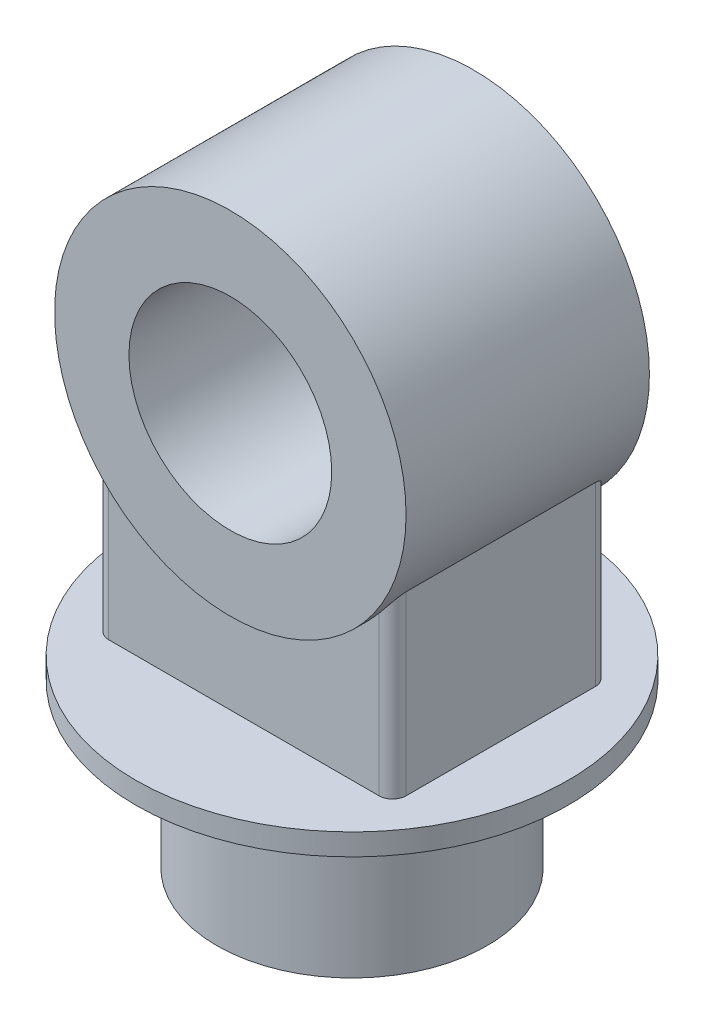
ISO-10303-21;
HEADER;
FILE_DESCRIPTION(('STEP AP214'),'2;1');
FILE_NAME('part.step','',(''),(''),'','','');
FILE_SCHEMA(('AUTOMOTIVE_DESIGN { 1 0 10303 214 1 1 1 1 }'));
ENDSEC;
DATA;
#1=APPLICATION_CONTEXT('core data for automotive mechanical design processes');
#2=APPLICATION_PROTOCOL_DEFINITION('international standard','automotive_design',2000,#1);
#3=PRODUCT_CONTEXT('',#1,'mechanical');
#4=PRODUCT('Part','Part','',(#3));
#5=PRODUCT_RELATED_PRODUCT_CATEGORY('part','',(#4));
#6=PRODUCT_DEFINITION_FORMATION('','',#4);
#7=PRODUCT_DEFINITION_CONTEXT('part definition',#1,'design');
#8=PRODUCT_DEFINITION('design','',#6,#7);
#9=PRODUCT_DEFINITION_SHAPE('','',#8);
#10=(LENGTH_UNIT() NAMED_UNIT(*) SI_UNIT(.MILLI.,.METRE.));
#11=(NAMED_UNIT(*) PLANE_ANGLE_UNIT() SI_UNIT($,.RADIAN.));
#12=(NAMED_UNIT(*) SI_UNIT($,.STERADIAN.) SOLID_ANGLE_UNIT());
#13=UNCERTAINTY_MEASURE_WITH_UNIT(LENGTH_MEASURE(1.E-05),#10,'distance_accuracy_value','');
#14=(GEOMETRIC_REPRESENTATION_CONTEXT(3) GLOBAL_UNCERTAINTY_ASSIGNED_CONTEXT((#13)) GLOBAL_UNIT_ASSIGNED_CONTEXT((#10,
#11,#12)) REPRESENTATION_CONTEXT('',''));
#15=CARTESIAN_POINT('',(0.,0.,0.));
#16=DIRECTION('',(0.,0.,1.));
#17=DIRECTION('',(1.,0.,0.));
#18=AXIS2_PLACEMENT_3D('',#15,#16,#17);
#19=CARTESIAN_POINT('',(0.,120.,0.));
#20=DIRECTION('',(0.,-1.,0.));
#21=DIRECTION('',(0.,0.,-1.));
#22=AXIS2_PLACEMENT_3D('',#19,#20,#21);
#23=CYLINDRICAL_SURFACE('',#22,100.);
#24=CARTESIAN_POINT('',(0.,120.,0.));
#25=DIRECTION('',(0.,1.,0.));
#26=DIRECTION('',(0.,0.,1.));
#27=AXIS2_PLACEMENT_3D('',#24,#25,#26);
#28=CIRCLE('',#27,100.);
#29=CARTESIAN_POINT('',(0.,120.,100.));
#30=VERTEX_POINT('',#29);
#31=EDGE_CURVE('E142',#30,#30,#28,.T.);
#32=ORIENTED_EDGE('',*,*,#31,.F.);
#33=EDGE_LOOP('',(#32));
#34=FACE_BOUND('',#33,.T.);
#35=CARTESIAN_POINT('',(0.,0.,0.));
#36=DIRECTION('',(0.,1.,0.));
#37=DIRECTION('',(0.,0.,1.));
#38=AXIS2_PLACEMENT_3D('',#35,#36,#37);
#39=CIRCLE('',#38,100.);
#40=CARTESIAN_POINT('',(0.,0.,100.));
#41=VERTEX_POINT('',#40);
#42=EDGE_CURVE('E215',#41,#41,#39,.T.);
#43=ORIENTED_EDGE('',*,*,#42,.T.);
#44=EDGE_LOOP('',(#43));
#45=FACE_BOUND('',#44,.T.);
#46=ADVANCED_FACE('F41',(#34,#45),#23,.T.);
#47=CARTESIAN_POINT('',(0.,0.,0.));
#48=DIRECTION('',(0.,1.,0.));
#49=DIRECTION('',(0.,0.,1.));
#50=AXIS2_PLACEMENT_3D('',#47,#48,#49);
#51=PLANE('',#50);
#52=ORIENTED_EDGE('',*,*,#42,.F.);
#53=EDGE_LOOP('',(#52));
#54=FACE_BOUND('',#53,.T.);
#55=ADVANCED_FACE('F203',(#54),#51,.F.);
#56=CARTESIAN_POINT('',(0.,136.,0.));
#57=DIRECTION('',(0.,-1.,0.));
#58=DIRECTION('',(0.,0.,-1.));
#59=AXIS2_PLACEMENT_3D('',#56,#57,#58);
#60=CYLINDRICAL_SURFACE('',#59,160.);
#61=CARTESIAN_POINT('',(0.,136.,0.));
#62=DIRECTION('',(0.,1.,0.));
#63=DIRECTION('',(0.,0.,1.));
#64=AXIS2_PLACEMENT_3D('',#61,#62,#63);
#65=CIRCLE('',#64,160.);
#66=CARTESIAN_POINT('',(0.,136.,160.));
#67=VERTEX_POINT('',#66);
#68=EDGE_CURVE('E216',#67,#67,#65,.T.);
#69=ORIENTED_EDGE('',*,*,#68,.F.);
#70=EDGE_LOOP('',(#69));
#71=FACE_BOUND('',#70,.T.);
#72=CARTESIAN_POINT('',(0.,120.,0.));
#73=DIRECTION('',(0.,1.,0.));
#74=DIRECTION('',(0.,0.,1.));
#75=AXIS2_PLACEMENT_3D('',#72,#73,#74);
#76=CIRCLE('',#75,160.);
#77=CARTESIAN_POINT('',(0.,120.,160.));
#78=VERTEX_POINT('',#77);
#79=EDGE_CURVE('E219',#78,#78,#76,.T.);
#80=ORIENTED_EDGE('',*,*,#79,.T.);
#81=EDGE_LOOP('',(#80));
#82=FACE_BOUND('',#81,.T.);
#83=ADVANCED_FACE('F208',(#71,#82),#60,.T.);
#84=CARTESIAN_POINT('',(0.,136.,0.));
#85=DIRECTION('',(0.,1.,0.));
#86=DIRECTION('',(0.,0.,1.));
#87=AXIS2_PLACEMENT_3D('',#84,#85,#86);
#88=PLANE('',#87);
#89=DIRECTION('',(0.,0.,-1.));
#90=VECTOR('',#89,1.);
#91=CARTESIAN_POINT('',(110.,136.,-80.));
#92=LINE('',#91,#90);
#93=CARTESIAN_POINT('',(110.,136.,70.));
#94=VERTEX_POINT('',#93);
#95=CARTESIAN_POINT('',(110.,136.,-70.));
#96=VERTEX_POINT('',#95);
#97=EDGE_CURVE('E223',#94,#96,#92,.T.);
#98=ORIENTED_EDGE('',*,*,#97,.F.);
#99=CARTESIAN_POINT('',(100.,136.,70.));
#100=DIRECTION('',(0.,1.,0.));
#101=DIRECTION('',(0.,0.,1.));
#102=AXIS2_PLACEMENT_3D('',#99,#100,#101);
#103=CIRCLE('',#102,10.);
#104=CARTESIAN_POINT('',(100.,136.,80.));
#105=VERTEX_POINT('',#104);
#106=EDGE_CURVE('E55',#94,#105,#103,.F.);
#107=ORIENTED_EDGE('',*,*,#106,.T.);
#108=DIRECTION('',(1.,0.,0.));
#109=VECTOR('',#108,1.);
#110=CARTESIAN_POINT('',(-110.,136.,80.));
#111=LINE('',#110,#109);
#112=CARTESIAN_POINT('',(-100.,136.,80.));
#113=VERTEX_POINT('',#112);
#114=EDGE_CURVE('E230',#113,#105,#111,.T.);
#115=ORIENTED_EDGE('',*,*,#114,.F.);
#116=CARTESIAN_POINT('',(-100.,136.,70.));
#117=DIRECTION('',(0.,1.,0.));
#118=DIRECTION('',(0.,0.,1.));
#119=AXIS2_PLACEMENT_3D('',#116,#117,#118);
#120=CIRCLE('',#119,10.);
#121=CARTESIAN_POINT('',(-110.,136.,70.));
#122=VERTEX_POINT('',#121);
#123=EDGE_CURVE('E69',#113,#122,#120,.F.);
#124=ORIENTED_EDGE('',*,*,#123,.T.);
#125=DIRECTION('',(0.,0.,1.));
#126=VECTOR('',#125,1.);
#127=CARTESIAN_POINT('',(-110.,136.,-80.));
#128=LINE('',#127,#126);
#129=CARTESIAN_POINT('',(-110.,136.,-70.));
#130=VERTEX_POINT('',#129);
#131=EDGE_CURVE('E232',#130,#122,#128,.T.);
#132=ORIENTED_EDGE('',*,*,#131,.F.);
#133=CARTESIAN_POINT('',(-100.,136.,-70.));
#134=DIRECTION('',(0.,1.,0.));
#135=DIRECTION('',(0.,0.,1.));
#136=AXIS2_PLACEMENT_3D('',#133,#134,#135);
#137=CIRCLE('',#136,10.);
#138=CARTESIAN_POINT('',(-100.,136.,-80.));
#139=VERTEX_POINT('',#138);
#140=EDGE_CURVE('E125',#130,#139,#137,.F.);
#141=ORIENTED_EDGE('',*,*,#140,.T.);
#142=DIRECTION('',(-1.,0.,0.));
#143=VECTOR('',#142,1.);
#144=CARTESIAN_POINT('',(-110.,136.,-80.));
#145=LINE('',#144,#143);
#146=CARTESIAN_POINT('',(100.,136.,-80.));
#147=VERTEX_POINT('',#146);
#148=EDGE_CURVE('E229',#147,#139,#145,.T.);
#149=ORIENTED_EDGE('',*,*,#148,.F.);
#150=CARTESIAN_POINT('',(100.,136.,-70.));
#151=DIRECTION('',(0.,1.,0.));
#152=DIRECTION('',(0.,0.,1.));
#153=AXIS2_PLACEMENT_3D('',#150,#151,#152);
#154=CIRCLE('',#153,10.);
#155=EDGE_CURVE('E124',#147,#96,#154,.F.);
#156=ORIENTED_EDGE('',*,*,#155,.T.);
#157=EDGE_LOOP('',(#98,#107,#115,#124,#132,#141,#149,#156));
#158=FACE_BOUND('',#157,.T.);
#159=ORIENTED_EDGE('',*,*,#68,.T.);
#160=EDGE_LOOP('',(#159));
#161=FACE_BOUND('',#160,.T.);
#162=ADVANCED_FACE('F274',(#158,#161),#88,.T.);
#163=CARTESIAN_POINT('',(0.,120.,0.));
#164=DIRECTION('',(0.,1.,0.));
#165=DIRECTION('',(0.,0.,1.));
#166=AXIS2_PLACEMENT_3D('',#163,#164,#165);
#167=PLANE('',#166);
#168=ORIENTED_EDGE('',*,*,#31,.T.);
#169=EDGE_LOOP('',(#168));
#170=FACE_BOUND('',#169,.T.);
#171=ORIENTED_EDGE('',*,*,#79,.F.);
#172=EDGE_LOOP('',(#171));
#173=FACE_BOUND('',#172,.T.);
#174=ADVANCED_FACE('F278',(#170,#173),#167,.F.);
#175=CARTESIAN_POINT('',(-110.,466.002,-80.));
#176=DIRECTION('',(0.,0.,1.));
#177=DIRECTION('',(1.,0.,0.));
#178=AXIS2_PLACEMENT_3D('',#175,#176,#177);
#179=PLANE('',#178);
#180=ORIENTED_EDGE('',*,*,#148,.T.);
#181=DIRECTION('',(0.,-1.,0.));
#182=VECTOR('',#181,1.);
#183=CARTESIAN_POINT('',(-100.,466.002,-80.));
#184=LINE('',#183,#182);
#185=CARTESIAN_POINT('',(-100.,252.933761370819,-80.));
#186=VERTEX_POINT('',#185);
#187=EDGE_CURVE('E140',#139,#186,#184,.F.);
#188=ORIENTED_EDGE('',*,*,#187,.T.);
#189=CARTESIAN_POINT('',(0.,336.,-80.));
#190=DIRECTION('',(0.,0.,1.));
#191=DIRECTION('',(1.,0.,0.));
#192=AXIS2_PLACEMENT_3D('',#189,#190,#191);
#193=CIRCLE('',#192,130.);
#194=CARTESIAN_POINT('',(100.,252.933761370819,-80.));
#195=VERTEX_POINT('',#194);
#196=EDGE_CURVE('E120',#195,#186,#193,.F.);
#197=ORIENTED_EDGE('',*,*,#196,.F.);
#198=DIRECTION('',(0.,-1.,0.));
#199=VECTOR('',#198,1.);
#200=CARTESIAN_POINT('',(100.,466.002,-80.));
#201=LINE('',#200,#199);
#202=EDGE_CURVE('E137',#195,#147,#201,.T.);
#203=ORIENTED_EDGE('',*,*,#202,.T.);
#204=EDGE_LOOP('',(#180,#188,#197,#203));
#205=FACE_BOUND('',#204,.T.);
#206=ADVANCED_FACE('F285',(#205),#179,.F.);
#207=CARTESIAN_POINT('',(110.,466.002,-80.));
#208=DIRECTION('',(-1.,0.,0.));
#209=DIRECTION('',(0.,0.,1.));
#210=AXIS2_PLACEMENT_3D('',#207,#208,#209);
#211=PLANE('',#210);
#212=ORIENTED_EDGE('',*,*,#97,.T.);
#213=DIRECTION('',(0.,-1.,0.));
#214=VECTOR('',#213,1.);
#215=CARTESIAN_POINT('',(110.,466.002,-70.));
#216=LINE('',#215,#214);
#217=CARTESIAN_POINT('',(110.,266.717967697245,-70.));
#218=VERTEX_POINT('',#217);
#219=EDGE_CURVE('E150',#96,#218,#216,.F.);
#220=ORIENTED_EDGE('',*,*,#219,.T.);
#221=DIRECTION('',(0.,0.,-1.));
#222=VECTOR('',#221,1.);
#223=CARTESIAN_POINT('',(110.,266.717967697245,90.));
#224=LINE('',#223,#222);
#225=CARTESIAN_POINT('',(110.,266.717967697245,70.));
#226=VERTEX_POINT('',#225);
#227=EDGE_CURVE('E226',#226,#218,#224,.T.);
#228=ORIENTED_EDGE('',*,*,#227,.F.);
#229=DIRECTION('',(0.,-1.,0.));
#230=VECTOR('',#229,1.);
#231=CARTESIAN_POINT('',(110.,466.002,70.));
#232=LINE('',#231,#230);
#233=EDGE_CURVE('E147',#226,#94,#232,.T.);
#234=ORIENTED_EDGE('',*,*,#233,.T.);
#235=EDGE_LOOP('',(#212,#220,#228,#234));
#236=FACE_BOUND('',#235,.T.);
#237=ADVANCED_FACE('F289',(#236),#211,.F.);
#238=CARTESIAN_POINT('',(-110.,466.002,-80.));
#239=DIRECTION('',(1.,0.,0.));
#240=DIRECTION('',(0.,0.,-1.));
#241=AXIS2_PLACEMENT_3D('',#238,#239,#240);
#242=PLANE('',#241);
#243=DIRECTION('',(0.,0.,-1.));
#244=VECTOR('',#243,1.);
#245=CARTESIAN_POINT('',(-110.,266.717967697245,90.));
#246=LINE('',#245,#244);
#247=CARTESIAN_POINT('',(-110.,266.717967697245,-70.));
#248=VERTEX_POINT('',#247);
#249=CARTESIAN_POINT('',(-110.,266.717967697245,70.));
#250=VERTEX_POINT('',#249);
#251=EDGE_CURVE('E117',#248,#250,#246,.F.);
#252=ORIENTED_EDGE('',*,*,#251,.F.);
#253=DIRECTION('',(0.,-1.,0.));
#254=VECTOR('',#253,1.);
#255=CARTESIAN_POINT('',(-110.,466.002,-70.));
#256=LINE('',#255,#254);
#257=EDGE_CURVE('E131',#248,#130,#256,.T.);
#258=ORIENTED_EDGE('',*,*,#257,.T.);
#259=ORIENTED_EDGE('',*,*,#131,.T.);
#260=DIRECTION('',(0.,-1.,0.));
#261=VECTOR('',#260,1.);
#262=CARTESIAN_POINT('',(-110.,466.002,70.));
#263=LINE('',#262,#261);
#264=EDGE_CURVE('E133',#122,#250,#263,.F.);
#265=ORIENTED_EDGE('',*,*,#264,.T.);
#266=EDGE_LOOP('',(#252,#258,#259,#265));
#267=FACE_BOUND('',#266,.T.);
#268=ADVANCED_FACE('F129',(#267),#242,.F.);
#269=CARTESIAN_POINT('',(-110.,466.002,80.));
#270=DIRECTION('',(0.,0.,-1.));
#271=DIRECTION('',(-1.,0.,0.));
#272=AXIS2_PLACEMENT_3D('',#269,#270,#271);
#273=PLANE('',#272);
#274=CARTESIAN_POINT('',(0.,336.,80.));
#275=DIRECTION('',(0.,0.,-1.));
#276=DIRECTION('',(-1.,0.,0.));
#277=AXIS2_PLACEMENT_3D('',#274,#275,#276);
#278=CIRCLE('',#277,130.);
#279=CARTESIAN_POINT('',(-100.,252.933761370819,80.));
#280=VERTEX_POINT('',#279);
#281=CARTESIAN_POINT('',(100.,252.933761370819,80.));
#282=VERTEX_POINT('',#281);
#283=EDGE_CURVE('E134',#280,#282,#278,.F.);
#284=ORIENTED_EDGE('',*,*,#283,.F.);
#285=DIRECTION('',(0.,-1.,0.));
#286=VECTOR('',#285,1.);
#287=CARTESIAN_POINT('',(-100.,466.002,80.));
#288=LINE('',#287,#286);
#289=EDGE_CURVE('E154',#280,#113,#288,.T.);
#290=ORIENTED_EDGE('',*,*,#289,.T.);
#291=ORIENTED_EDGE('',*,*,#114,.T.);
#292=DIRECTION('',(0.,-1.,0.));
#293=VECTOR('',#292,1.);
#294=CARTESIAN_POINT('',(100.,466.002,80.));
#295=LINE('',#294,#293);
#296=EDGE_CURVE('E152',#105,#282,#295,.F.);
#297=ORIENTED_EDGE('',*,*,#296,.T.);
#298=EDGE_LOOP('',(#284,#290,#291,#297));
#299=FACE_BOUND('',#298,.T.);
#300=ADVANCED_FACE('F193',(#299),#273,.F.);
#301=CARTESIAN_POINT('',(0.,336.,90.));
#302=DIRECTION('',(0.,0.,-1.));
#303=DIRECTION('',(-1.,0.,0.));
#304=AXIS2_PLACEMENT_3D('',#301,#302,#303);
#305=CYLINDRICAL_SURFACE('',#304,130.);
#306=CARTESIAN_POINT('',(0.,336.,90.));
#307=DIRECTION('',(0.,0.,1.));
#308=DIRECTION('',(1.,0.,0.));
#309=AXIS2_PLACEMENT_3D('',#306,#307,#308);
#310=CIRCLE('',#309,130.);
#311=CARTESIAN_POINT('',(130.,336.,90.));
#312=VERTEX_POINT('',#311);
#313=EDGE_CURVE('E195',#312,#312,#310,.T.);
#314=ORIENTED_EDGE('',*,*,#313,.F.);
#315=EDGE_LOOP('',(#314));
#316=FACE_BOUND('',#315,.T.);
#317=CARTESIAN_POINT('',(0.,336.,-90.));
#318=DIRECTION('',(0.,0.,1.));
#319=DIRECTION('',(1.,0.,0.));
#320=AXIS2_PLACEMENT_3D('',#317,#318,#319);
#321=CIRCLE('',#320,130.);
#322=CARTESIAN_POINT('',(130.,336.,-90.));
#323=VERTEX_POINT('',#322);
#324=EDGE_CURVE('E238',#323,#323,#321,.T.);
#325=ORIENTED_EDGE('',*,*,#324,.T.);
#326=EDGE_LOOP('',(#325));
#327=FACE_BOUND('',#326,.T.);
#328=ORIENTED_EDGE('',*,*,#283,.T.);
#329=CARTESIAN_POINT('',(100.,252.933761370819,80.));
#330=CARTESIAN_POINT('',(100.223611151915,253.202952503255,79.9999830665315));
#331=CARTESIAN_POINT('',(100.446118360057,253.473036166024,79.9924995885085));
#332=CARTESIAN_POINT('',(100.888548742496,254.014496760122,79.9629173131463));
#333=CARTESIAN_POINT('',(101.108472043759,254.285873626978,79.9408192370116));
#334=CARTESIAN_POINT('',(101.545586290072,254.829711400373,79.8822979337703));
#335=CARTESIAN_POINT('',(101.76277446753,255.102173087004,79.8458612385231));
#336=CARTESIAN_POINT('',(102.193849033468,255.647413797012,79.7588609087488));
#337=CARTESIAN_POINT('',(102.407735374993,255.920192824843,79.7082970735217));
#338=CARTESIAN_POINT('',(103.048408055095,256.74400885936,79.5343891784366));
#339=CARTESIAN_POINT('',(103.469748368072,257.294974230618,79.3894263280958));
#340=CARTESIAN_POINT('',(104.088382224678,258.117224843771,79.1288060997197));
#341=CARTESIAN_POINT('',(104.292337034927,258.39057162742,79.0347525474724));
#342=CARTESIAN_POINT('',(104.695498702643,258.935304765081,78.8319429710982));
#343=CARTESIAN_POINT('',(104.894706004332,259.206691300842,78.7231883289499));
#344=CARTESIAN_POINT('',(105.336170271764,259.812965668139,78.4620472638272));
#345=CARTESIAN_POINT('',(105.577006541077,260.147108038148,78.3055009036513));
#346=CARTESIAN_POINT('',(106.04966094987,260.809343252621,77.967808626391));
#347=CARTESIAN_POINT('',(106.281479043935,261.137436066616,77.7866625854444));
#348=CARTESIAN_POINT('',(106.734152264033,261.784259610706,77.3986376161628));
#349=CARTESIAN_POINT('',(106.955036134368,262.103013877598,77.1918317878757));
#350=CARTESIAN_POINT('',(107.384708325122,262.728803605627,76.749894392022));
#351=CARTESIAN_POINT('',(107.593501627276,263.035843875289,76.5147746155492));
#352=CARTESIAN_POINT('',(107.921279015409,263.522080966666,76.1068757916446));
#353=CARTESIAN_POINT('',(108.044709884718,263.706240813682,75.9435605188263));
#354=CARTESIAN_POINT('',(108.284949666933,264.066582834907,75.6038296157538));
#355=CARTESIAN_POINT('',(108.401760304956,264.242767084986,75.4274174262629));
#356=CARTESIAN_POINT('',(108.627683741988,264.585236991633,75.0605773993746));
#357=CARTESIAN_POINT('',(108.736797961361,264.751524473746,74.8701521613913));
#358=CARTESIAN_POINT('',(108.945874410432,265.071634412635,74.4745306992528));
#359=CARTESIAN_POINT('',(109.04583974995,265.225461102935,74.2693395369045));
#360=CARTESIAN_POINT('',(109.274660386151,265.579056080623,73.7536743100227));
#361=CARTESIAN_POINT('',(109.398046362816,265.771031349643,73.4351396850742));
#362=CARTESIAN_POINT('',(109.561336457207,266.026263049992,72.9345418523036));
#363=CARTESIAN_POINT('',(109.612072269395,266.105785634321,72.7641622498837));
#364=CARTESIAN_POINT('',(109.705421847597,266.25239837099,72.4160328323223));
#365=CARTESIAN_POINT('',(109.748040656091,266.319496241142,72.2382876769633));
#366=CARTESIAN_POINT('',(109.820262744001,266.433384610412,71.8947331689276));
#367=CARTESIAN_POINT('',(109.850752312767,266.481551609067,71.729567610939));
#368=CARTESIAN_POINT('',(109.903691363628,266.565274678988,71.3948451418076));
#369=CARTESIAN_POINT('',(109.926143541964,266.600834979285,71.2252897238033));
#370=CARTESIAN_POINT('',(109.962659042777,266.658707696818,70.8807814271977));
#371=CARTESIAN_POINT('',(109.976613864032,266.680848750137,70.7057875562757));
#372=CARTESIAN_POINT('',(109.99061964662,266.703076138542,70.4419386674803));
#373=CARTESIAN_POINT('',(109.99413386492,266.708654625171,70.3536902139711));
#374=CARTESIAN_POINT('',(109.998824989492,266.716102079046,70.1769662160102));
#375=CARTESIAN_POINT('',(110.000001659485,266.717970671296,70.088490649507));
#376=CARTESIAN_POINT('',(110.,266.717967697245,70.));
#377=B_SPLINE_CURVE_WITH_KNOTS('',3,(#329,#330,#331,#332,#333,#334,#335,#336,#337,#338,#339,
#340,#341,#342,#343,#344,#345,#346,#347,#348,#349,#350,#351,#352,#353,#354,#355,#356,#357,#358,
#359,#360,#361,#362,#363,#364,#365,#366,#367,#368,#369,#370,#371,#372,#373,#374,#375,#376),
.UNSPECIFIED.,.F.,.F.,(4,2,2,2,2,2,2,2,2,2,2,2,2,2,2,2,2,2,2,2,2,2,2,4),(0.,1.04974156507782,
2.09943133114573,3.15010942417265,4.20080244462031,6.3235627893386,7.38465211465333,
8.44564176134499,9.76677685539395,11.087918601761,12.4053795382948,13.7222937149077,
14.5479419827464,15.3733741023698,16.1986534888326,17.023651302289,18.194686650492,
18.7783719827905,19.3616935243415,19.8852298594992,20.4085904030381,20.9385006934629,
21.2038887699913,21.4693036704869),.UNSPECIFIED.);
#378=EDGE_CURVE('E11',#282,#226,#377,.T.);
#379=ORIENTED_EDGE('',*,*,#378,.T.);
#380=ORIENTED_EDGE('',*,*,#227,.T.);
#381=CARTESIAN_POINT('',(110.,266.717967697245,-70.));
#382=CARTESIAN_POINT('',(110.000033683462,266.718025852698,-70.1614230595313));
#383=CARTESIAN_POINT('',(109.996092792414,266.711764254296,-70.3228118197691));
#384=CARTESIAN_POINT('',(109.980519982779,266.687045880384,-70.6441123999958));
#385=CARTESIAN_POINT('',(109.968896213713,266.668602027069,-70.8040256031146));
#386=CARTESIAN_POINT('',(109.938376398954,266.620217986395,-71.1196424551221));
#387=CARTESIAN_POINT('',(109.919558261622,266.590400967593,-71.2753727040436));
#388=CARTESIAN_POINT('',(109.875071558334,266.52000006118,-71.5834085562726));
#389=CARTESIAN_POINT('',(109.849400846184,266.479412800404,-71.7357130704249));
#390=CARTESIAN_POINT('',(109.784772267017,266.377386983169,-72.0722520040974));
#391=CARTESIAN_POINT('',(109.744103525393,266.313281105856,-72.2553511890568));
#392=CARTESIAN_POINT('',(109.654040532803,266.17165023193,-72.6141464391851));
#393=CARTESIAN_POINT('',(109.604640075501,266.094115691273,-72.7898371277865));
#394=CARTESIAN_POINT('',(109.497968805892,265.927147418338,-73.1338723913451));
#395=CARTESIAN_POINT('',(109.440667457039,265.837667562915,-73.3021849515411));
#396=CARTESIAN_POINT('',(109.319341126161,265.648779195145,-73.6304969218559));
#397=CARTESIAN_POINT('',(109.25531768694,265.549372961282,-73.7904982269664));
#398=CARTESIAN_POINT('',(109.085069343255,265.28590129292,-74.1868876463209));
#399=CARTESIAN_POINT('',(108.974781990569,265.115997241409,-74.4176642111939));
#400=CARTESIAN_POINT('',(108.742772943656,264.76058359918,-74.8607110351426));
#401=CARTESIAN_POINT('',(108.621044869784,264.575065307649,-75.072970840064));
#402=CARTESIAN_POINT('',(108.36794946479,264.19164129378,-75.4804206329535));
#403=CARTESIAN_POINT('',(108.236568322626,263.993717884812,-75.6755852518652));
#404=CARTESIAN_POINT('',(107.965814499919,263.588382733387,-76.0497203250662));
#405=CARTESIAN_POINT('',(107.826442440892,263.380971729107,-76.2286920360201));
#406=CARTESIAN_POINT('',(107.56145650763,262.989174407744,-76.5468161797372));
#407=CARTESIAN_POINT('',(107.436764821801,262.805791987749,-76.6879854690674));
#408=CARTESIAN_POINT('',(107.182869679799,262.434497987953,-76.9599552926784));
#409=CARTESIAN_POINT('',(107.053665586411,262.24658576965,-77.0907543539386));
#410=CARTESIAN_POINT('',(106.659844344167,261.677121003612,-77.4685356621902));
#411=CARTESIAN_POINT('',(106.389102445143,261.289965080353,-77.7008024816961));
#412=CARTESIAN_POINT('',(105.833418194947,260.504836154638,-78.129863631631));
#413=CARTESIAN_POINT('',(105.548442441802,260.106838810795,-78.3265689888296));
#414=CARTESIAN_POINT('',(104.96676628824,259.304344779382,-78.6860846955172));
#415=CARTESIAN_POINT('',(104.670068038633,258.899849292081,-78.8489012287858));
#416=CARTESIAN_POINT('',(104.024574509401,258.030646711215,-79.1623550419402));
#417=CARTESIAN_POINT('',(103.674248758637,257.565348460988,-79.3081944572229));
#418=CARTESIAN_POINT('',(102.961876677953,256.632523338709,-79.558756520093));
#419=CARTESIAN_POINT('',(102.599828734006,256.16499616738,-79.6634734792563));
#420=CARTESIAN_POINT('',(102.051092736822,255.466397204689,-79.7891645729388));
#421=CARTESIAN_POINT('',(101.868137468165,255.235094848973,-79.8257282191265));
#422=CARTESIAN_POINT('',(101.499966150616,254.77288550036,-79.8886289353229));
#423=CARTESIAN_POINT('',(101.314750133026,254.541978502041,-79.9149661467555));
#424=CARTESIAN_POINT('',(100.942320486513,254.080919722901,-79.9572665465168));
#425=CARTESIAN_POINT('',(100.755107350153,253.850767773367,-79.9732322353467));
#426=CARTESIAN_POINT('',(100.378860262163,253.391449185777,-79.9945948234744));
#427=CARTESIAN_POINT('',(100.189826234412,253.162282589497,-79.9999912789888));
#428=CARTESIAN_POINT('',(100.,252.933761370819,-80.));
#429=B_SPLINE_CURVE_WITH_KNOTS('',3,(#381,#382,#383,#384,#385,#386,#387,#388,#389,#390,#391,
#392,#393,#394,#395,#396,#397,#398,#399,#400,#401,#402,#403,#404,#405,#406,#407,#408,#409,#410,
#411,#412,#413,#414,#415,#416,#417,#418,#419,#420,#421,#422,#423,#424,#425,#426,#427,#428),
.UNSPECIFIED.,.F.,.F.,(4,2,2,2,2,2,2,2,2,2,2,2,2,2,2,2,2,2,2,2,2,2,2,4),(0.,0.484045005923083,
0.967577389145412,1.44601544684507,1.92460352520314,2.51835043890468,3.11252108624076,
3.70905613988741,4.30545457926273,5.22516595363372,6.14539326092329,7.06696382284195,
7.98846280401965,8.77680092000544,9.56525081419898,11.1426900482287,12.7240229357798,
14.305067020047,16.1047501551828,17.9046821508917,18.7960435003637,19.6873925225409,
20.5785265668948,21.4696980275819),.UNSPECIFIED.);
#430=EDGE_CURVE('E178',#218,#195,#429,.T.);
#431=ORIENTED_EDGE('',*,*,#430,.T.);
#432=ORIENTED_EDGE('',*,*,#196,.T.);
#433=CARTESIAN_POINT('',(-100.,252.933761370819,-80.));
#434=CARTESIAN_POINT('',(-100.223611151915,253.202952503255,-79.9999830665315));
#435=CARTESIAN_POINT('',(-100.446118360057,253.473036166024,-79.9924995885085));
#436=CARTESIAN_POINT('',(-100.888548742496,254.014496760122,-79.9629173131463));
#437=CARTESIAN_POINT('',(-101.108472043759,254.285873626978,-79.9408192370116));
#438=CARTESIAN_POINT('',(-101.545586290072,254.829711400373,-79.8822979337703));
#439=CARTESIAN_POINT('',(-101.76277446753,255.102173087004,-79.8458612385231));
#440=CARTESIAN_POINT('',(-102.193849033468,255.647413797012,-79.7588609087488));
#441=CARTESIAN_POINT('',(-102.407735374993,255.920192824843,-79.7082970735217));
#442=CARTESIAN_POINT('',(-103.048408055095,256.74400885936,-79.5343891784366));
#443=CARTESIAN_POINT('',(-103.469748368072,257.294974230618,-79.3894263280958));
#444=CARTESIAN_POINT('',(-104.088382224678,258.117224843771,-79.1288060997198));
#445=CARTESIAN_POINT('',(-104.292337034927,258.39057162742,-79.0347525474725));
#446=CARTESIAN_POINT('',(-104.695498702643,258.935304765081,-78.8319429710982));
#447=CARTESIAN_POINT('',(-104.894706004332,259.206691300842,-78.7231883289499));
#448=CARTESIAN_POINT('',(-105.336170271764,259.812965668139,-78.4620472638272));
#449=CARTESIAN_POINT('',(-105.577006541077,260.147108038148,-78.3055009036513));
#450=CARTESIAN_POINT('',(-106.04966094987,260.809343252621,-77.967808626391));
#451=CARTESIAN_POINT('',(-106.281479043935,261.137436066616,-77.7866625854444));
#452=CARTESIAN_POINT('',(-106.734152264033,261.784259610706,-77.3986376161629));
#453=CARTESIAN_POINT('',(-106.955036134368,262.103013877599,-77.1918317878758));
#454=CARTESIAN_POINT('',(-107.384708325122,262.728803605627,-76.7498943920221));
#455=CARTESIAN_POINT('',(-107.593501627276,263.035843875289,-76.5147746155493));
#456=CARTESIAN_POINT('',(-107.921279015409,263.522080966666,-76.1068757916446));
#457=CARTESIAN_POINT('',(-108.044709884718,263.706240813682,-75.9435605188263));
#458=CARTESIAN_POINT('',(-108.284949666933,264.066582834907,-75.6038296157539));
#459=CARTESIAN_POINT('',(-108.401760304956,264.242767084986,-75.4274174262629));
#460=CARTESIAN_POINT('',(-108.627683741988,264.585236991633,-75.0605773993747));
#461=CARTESIAN_POINT('',(-108.736797961361,264.751524473746,-74.8701521613913));
#462=CARTESIAN_POINT('',(-108.945874410432,265.071634412635,-74.4745306992528));
#463=CARTESIAN_POINT('',(-109.04583974995,265.225461102935,-74.2693395369045));
#464=CARTESIAN_POINT('',(-109.274660386151,265.579056080623,-73.7536743100228));
#465=CARTESIAN_POINT('',(-109.398046362816,265.771031349643,-73.4351396850743));
#466=CARTESIAN_POINT('',(-109.561336457207,266.026263049992,-72.9345418523036));
#467=CARTESIAN_POINT('',(-109.612072269395,266.105785634321,-72.7641622498837));
#468=CARTESIAN_POINT('',(-109.705421847597,266.25239837099,-72.4160328323223));
#469=CARTESIAN_POINT('',(-109.748040656091,266.319496241142,-72.2382876769633));
#470=CARTESIAN_POINT('',(-109.820262744001,266.433384610412,-71.8947331689277));
#471=CARTESIAN_POINT('',(-109.850752312767,266.481551609067,-71.7295676109391));
#472=CARTESIAN_POINT('',(-109.903691363628,266.565274678988,-71.3948451418077));
#473=CARTESIAN_POINT('',(-109.926143541964,266.600834979285,-71.2252897238034));
#474=CARTESIAN_POINT('',(-109.962659042777,266.658707696818,-70.8807814271978));
#475=CARTESIAN_POINT('',(-109.976613864032,266.680848750137,-70.7057875562757));
#476=CARTESIAN_POINT('',(-109.99061964662,266.703076138542,-70.4419386674803));
#477=CARTESIAN_POINT('',(-109.99413386492,266.708654625171,-70.3536902139711));
#478=CARTESIAN_POINT('',(-109.998824989492,266.716102079046,-70.1769662160102));
#479=CARTESIAN_POINT('',(-110.000001659485,266.717970671296,-70.0884906495071));
#480=CARTESIAN_POINT('',(-110.,266.717967697245,-70.));
#481=B_SPLINE_CURVE_WITH_KNOTS('',3,(#433,#434,#435,#436,#437,#438,#439,#440,#441,#442,#443,
#444,#445,#446,#447,#448,#449,#450,#451,#452,#453,#454,#455,#456,#457,#458,#459,#460,#461,#462,
#463,#464,#465,#466,#467,#468,#469,#470,#471,#472,#473,#474,#475,#476,#477,#478,#479,#480),
.UNSPECIFIED.,.F.,.F.,(4,2,2,2,2,2,2,2,2,2,2,2,2,2,2,2,2,2,2,2,2,2,2,4),(0.,1.04974156507777,
2.09943133114568,3.1501094241726,4.20080244462026,6.32356278933854,7.38465211465329,
8.44564176134495,9.76677685539391,11.0879186017609,12.4053795382948,13.7222937149076,
14.5479419827463,15.3733741023697,16.1986534888326,17.0236513022889,18.1946866504919,
18.7783719827904,19.3616935243414,19.8852298594992,20.408590403038,20.9385006934629,
21.2038887699912,21.4693036704869),.UNSPECIFIED.);
#482=EDGE_CURVE('E113',#186,#248,#481,.T.);
#483=ORIENTED_EDGE('',*,*,#482,.T.);
#484=ORIENTED_EDGE('',*,*,#251,.T.);
#485=CARTESIAN_POINT('',(-110.,266.717967697245,70.));
#486=CARTESIAN_POINT('',(-110.000033683462,266.718025852698,70.1614230595313));
#487=CARTESIAN_POINT('',(-109.996092792414,266.711764254296,70.3228118197691));
#488=CARTESIAN_POINT('',(-109.980519982779,266.687045880384,70.6441123999957));
#489=CARTESIAN_POINT('',(-109.968896213713,266.668602027069,70.8040256031146));
#490=CARTESIAN_POINT('',(-109.938376398954,266.620217986395,71.1196424551221));
#491=CARTESIAN_POINT('',(-109.919558261622,266.590400967593,71.2753727040436));
#492=CARTESIAN_POINT('',(-109.875071558334,266.52000006118,71.5834085562726));
#493=CARTESIAN_POINT('',(-109.849400846184,266.479412800404,71.7357130704249));
#494=CARTESIAN_POINT('',(-109.784772267017,266.377386983169,72.0722520040974));
#495=CARTESIAN_POINT('',(-109.744103525393,266.313281105856,72.2553511890568));
#496=CARTESIAN_POINT('',(-109.654040532803,266.17165023193,72.6141464391851));
#497=CARTESIAN_POINT('',(-109.604640075501,266.094115691273,72.7898371277865));
#498=CARTESIAN_POINT('',(-109.497968805892,265.927147418338,73.133872391345));
#499=CARTESIAN_POINT('',(-109.440667457039,265.837667562915,73.302184951541));
#500=CARTESIAN_POINT('',(-109.319341126161,265.648779195145,73.6304969218558));
#501=CARTESIAN_POINT('',(-109.25531768694,265.549372961282,73.7904982269664));
#502=CARTESIAN_POINT('',(-109.085069343255,265.28590129292,74.1868876463209));
#503=CARTESIAN_POINT('',(-108.974781990569,265.115997241409,74.4176642111939));
#504=CARTESIAN_POINT('',(-108.742772943656,264.76058359918,74.8607110351426));
#505=CARTESIAN_POINT('',(-108.621044869784,264.575065307649,75.072970840064));
#506=CARTESIAN_POINT('',(-108.36794946479,264.19164129378,75.4804206329535));
#507=CARTESIAN_POINT('',(-108.236568322626,263.993717884812,75.6755852518652));
#508=CARTESIAN_POINT('',(-107.965814499919,263.588382733387,76.0497203250661));
#509=CARTESIAN_POINT('',(-107.826442440892,263.380971729107,76.2286920360201));
#510=CARTESIAN_POINT('',(-107.56145650763,262.989174407744,76.5468161797372));
#511=CARTESIAN_POINT('',(-107.436764821801,262.805791987749,76.6879854690673));
#512=CARTESIAN_POINT('',(-107.182869679799,262.434497987953,76.9599552926783));
#513=CARTESIAN_POINT('',(-107.053665586411,262.24658576965,77.0907543539386));
#514=CARTESIAN_POINT('',(-106.659844344167,261.677121003612,77.4685356621902));
#515=CARTESIAN_POINT('',(-106.389102445143,261.289965080353,77.7008024816961));
#516=CARTESIAN_POINT('',(-105.833418194947,260.504836154638,78.129863631631));
#517=CARTESIAN_POINT('',(-105.548442441802,260.106838810795,78.3265689888296));
#518=CARTESIAN_POINT('',(-104.96676628824,259.304344779382,78.6860846955171));
#519=CARTESIAN_POINT('',(-104.670068038633,258.899849292081,78.8489012287858));
#520=CARTESIAN_POINT('',(-104.024574509401,258.030646711215,79.1623550419402));
#521=CARTESIAN_POINT('',(-103.674248758637,257.565348460988,79.3081944572228));
#522=CARTESIAN_POINT('',(-102.961876677953,256.632523338709,79.558756520093));
#523=CARTESIAN_POINT('',(-102.599828734006,256.16499616738,79.6634734792563));
#524=CARTESIAN_POINT('',(-102.051092736822,255.466397204689,79.7891645729387));
#525=CARTESIAN_POINT('',(-101.868137468165,255.235094848973,79.8257282191264));
#526=CARTESIAN_POINT('',(-101.499966150616,254.77288550036,79.8886289353229));
#527=CARTESIAN_POINT('',(-101.314750133026,254.541978502041,79.9149661467555));
#528=CARTESIAN_POINT('',(-100.942320486513,254.080919722901,79.9572665465167));
#529=CARTESIAN_POINT('',(-100.755107350153,253.850767773367,79.9732322353467));
#530=CARTESIAN_POINT('',(-100.378860262163,253.391449185777,79.9945948234744));
#531=CARTESIAN_POINT('',(-100.189826234412,253.162282589497,79.9999912789887));
#532=CARTESIAN_POINT('',(-100.,252.933761370819,80.));
#533=B_SPLINE_CURVE_WITH_KNOTS('',3,(#485,#486,#487,#488,#489,#490,#491,#492,#493,#494,#495,
#496,#497,#498,#499,#500,#501,#502,#503,#504,#505,#506,#507,#508,#509,#510,#511,#512,#513,#514,
#515,#516,#517,#518,#519,#520,#521,#522,#523,#524,#525,#526,#527,#528,#529,#530,#531,#532),
.UNSPECIFIED.,.F.,.F.,(4,2,2,2,2,2,2,2,2,2,2,2,2,2,2,2,2,2,2,2,2,2,2,4),(0.,0.484045005923084,
0.967577389145426,1.44601544684507,1.92460352520314,2.51835043890468,3.11252108624077,
3.70905613988742,4.30545457926274,5.22516595363374,6.14539326092328,7.06696382284191,
7.98846280401964,8.77680092000539,9.56525081419896,11.1426900482287,12.7240229357798,
14.305067020047,16.1047501551828,17.9046821508917,18.7960435003637,19.6873925225409,
20.5785265668947,21.4696980275819),.UNSPECIFIED.);
#534=EDGE_CURVE('E185',#250,#280,#533,.T.);
#535=ORIENTED_EDGE('',*,*,#534,.T.);
#536=EDGE_LOOP('',(#328,#379,#380,#431,#432,#483,#484,#535));
#537=FACE_BOUND('',#536,.T.);
#538=ADVANCED_FACE('F116',(#316,#327,#537),#305,.T.);
#539=CARTESIAN_POINT('',(0.,336.,90.));
#540=DIRECTION('',(0.,0.,1.));
#541=DIRECTION('',(1.,0.,0.));
#542=AXIS2_PLACEMENT_3D('',#539,#540,#541);
#543=PLANE('',#542);
#544=ORIENTED_EDGE('',*,*,#313,.T.);
#545=EDGE_LOOP('',(#544));
#546=FACE_BOUND('',#545,.T.);
#547=CARTESIAN_POINT('',(0.,336.,90.));
#548=DIRECTION('',(0.,0.,1.));
#549=DIRECTION('',(1.,0.,0.));
#550=AXIS2_PLACEMENT_3D('',#547,#548,#549);
#551=CIRCLE('',#550,75.);
#552=CARTESIAN_POINT('',(-75.,336.,90.));
#553=VERTEX_POINT('',#552);
#554=EDGE_CURVE('E241',#553,#553,#551,.T.);
#555=ORIENTED_EDGE('',*,*,#554,.F.);
#556=EDGE_LOOP('',(#555));
#557=FACE_BOUND('',#556,.T.);
#558=ADVANCED_FACE('F252',(#546,#557),#543,.T.);
#559=CARTESIAN_POINT('',(0.,336.,-90.));
#560=DIRECTION('',(0.,0.,1.));
#561=DIRECTION('',(1.,0.,0.));
#562=AXIS2_PLACEMENT_3D('',#559,#560,#561);
#563=PLANE('',#562);
#564=ORIENTED_EDGE('',*,*,#324,.F.);
#565=EDGE_LOOP('',(#564));
#566=FACE_BOUND('',#565,.T.);
#567=CARTESIAN_POINT('',(0.,336.,-90.));
#568=DIRECTION('',(0.,0.,1.));
#569=DIRECTION('',(1.,0.,0.));
#570=AXIS2_PLACEMENT_3D('',#567,#568,#569);
#571=CIRCLE('',#570,75.);
#572=CARTESIAN_POINT('',(-75.,336.,-90.));
#573=VERTEX_POINT('',#572);
#574=EDGE_CURVE('E244',#573,#573,#571,.T.);
#575=ORIENTED_EDGE('',*,*,#574,.T.);
#576=EDGE_LOOP('',(#575));
#577=FACE_BOUND('',#576,.T.);
#578=ADVANCED_FACE('F254',(#566,#577),#563,.F.);
#579=CARTESIAN_POINT('',(0.,336.,90.));
#580=DIRECTION('',(0.,0.,-1.));
#581=DIRECTION('',(-1.,0.,0.));
#582=AXIS2_PLACEMENT_3D('',#579,#580,#581);
#583=CYLINDRICAL_SURFACE('',#582,75.);
#584=CARTESIAN_POINT('',(-75.,336.,90.));
#585=CARTESIAN_POINT('',(-75.,336.,88.125));
#586=CARTESIAN_POINT('',(-75.,336.,86.25));
#587=CARTESIAN_POINT('',(-75.,336.,82.5));
#588=CARTESIAN_POINT('',(-75.,336.,80.625));
#589=CARTESIAN_POINT('',(-75.,336.,76.875));
#590=CARTESIAN_POINT('',(-75.,336.,75.));
#591=CARTESIAN_POINT('',(-75.,336.,71.25));
#592=CARTESIAN_POINT('',(-75.,336.,69.375));
#593=CARTESIAN_POINT('',(-75.,336.,65.625));
#594=CARTESIAN_POINT('',(-75.,336.,63.75));
#595=CARTESIAN_POINT('',(-75.,336.,60.));
#596=CARTESIAN_POINT('',(-75.,336.,58.125));
#597=CARTESIAN_POINT('',(-75.,336.,54.375));
#598=CARTESIAN_POINT('',(-75.,336.,52.5));
#599=CARTESIAN_POINT('',(-75.,336.,48.75));
#600=CARTESIAN_POINT('',(-75.,336.,46.875));
#601=CARTESIAN_POINT('',(-75.,336.,43.125));
#602=CARTESIAN_POINT('',(-75.,336.,41.25));
#603=CARTESIAN_POINT('',(-75.,336.,37.5));
#604=CARTESIAN_POINT('',(-75.,336.,35.625));
#605=CARTESIAN_POINT('',(-75.,336.,31.875));
#606=CARTESIAN_POINT('',(-75.,336.,30.));
#607=CARTESIAN_POINT('',(-75.,336.,26.25));
#608=CARTESIAN_POINT('',(-75.,336.,24.375));
#609=CARTESIAN_POINT('',(-75.,336.,20.625));
#610=CARTESIAN_POINT('',(-75.,336.,18.75));
#611=CARTESIAN_POINT('',(-75.,336.,15.));
#612=CARTESIAN_POINT('',(-75.,336.,13.125));
#613=CARTESIAN_POINT('',(-75.,336.,9.37499999999998));
#614=CARTESIAN_POINT('',(-75.,336.,7.49999999999998));
#615=CARTESIAN_POINT('',(-75.,336.,3.74999999999998));
#616=CARTESIAN_POINT('',(-75.,336.,1.87499999999997));
#617=CARTESIAN_POINT('',(-75.,336.,-1.87500000000003));
#618=CARTESIAN_POINT('',(-75.,336.,-3.75000000000003));
#619=CARTESIAN_POINT('',(-75.,336.,-7.50000000000003));
#620=CARTESIAN_POINT('',(-75.,336.,-9.37500000000004));
#621=CARTESIAN_POINT('',(-75.,336.,-13.125));
#622=CARTESIAN_POINT('',(-75.,336.,-15.));
#623=CARTESIAN_POINT('',(-75.,336.,-18.75));
#624=CARTESIAN_POINT('',(-75.,336.,-20.625));
#625=CARTESIAN_POINT('',(-75.,336.,-24.375));
#626=CARTESIAN_POINT('',(-75.,336.,-26.25));
#627=CARTESIAN_POINT('',(-75.,336.,-30.));
#628=CARTESIAN_POINT('',(-75.,336.,-31.875));
#629=CARTESIAN_POINT('',(-75.,336.,-35.625));
#630=CARTESIAN_POINT('',(-75.,336.,-37.5));
#631=CARTESIAN_POINT('',(-75.,336.,-41.25));
#632=CARTESIAN_POINT('',(-75.,336.,-43.125));
#633=CARTESIAN_POINT('',(-75.,336.,-46.875));
#634=CARTESIAN_POINT('',(-75.,336.,-48.75));
#635=CARTESIAN_POINT('',(-75.,336.,-52.5));
#636=CARTESIAN_POINT('',(-75.,336.,-54.375));
#637=CARTESIAN_POINT('',(-75.,336.,-58.125));
#638=CARTESIAN_POINT('',(-75.,336.,-60.));
#639=CARTESIAN_POINT('',(-75.,336.,-63.75));
#640=CARTESIAN_POINT('',(-75.,336.,-65.625));
#641=CARTESIAN_POINT('',(-75.,336.,-69.375));
#642=CARTESIAN_POINT('',(-75.,336.,-71.25));
#643=CARTESIAN_POINT('',(-75.,336.,-75.));
#644=CARTESIAN_POINT('',(-75.,336.,-76.875));
#645=CARTESIAN_POINT('',(-75.,336.,-80.625));
#646=CARTESIAN_POINT('',(-75.,336.,-82.5));
#647=CARTESIAN_POINT('',(-75.,336.,-86.25));
#648=CARTESIAN_POINT('',(-75.,336.,-88.125));
#649=CARTESIAN_POINT('',(-75.,336.,-90.));
#650=B_SPLINE_CURVE_WITH_KNOTS('',3,(#584,#585,#586,#587,#588,#589,#590,#591,#592,#593,#594,
#595,#596,#597,#598,#599,#600,#601,#602,#603,#604,#605,#606,#607,#608,#609,#610,#611,#612,#613,
#614,#615,#616,#617,#618,#619,#620,#621,#622,#623,#624,#625,#626,#627,#628,#629,#630,#631,#632,
#633,#634,#635,#636,#637,#638,#639,#640,#641,#642,#643,#644,#645,#646,#647,#648,#649),
.UNSPECIFIED.,.F.,.F.,(4,2,2,2,2,2,2,2,2,2,2,2,2,2,2,2,2,2,2,2,2,2,2,2,2,2,2,2,2,2,2,2,4),(0.,
5.62499999999999,11.25,16.875,22.5,28.125,33.75,39.375,45.,50.625,56.25,61.875,67.5,73.125,
78.75,84.375,90.,95.625,101.25,106.875,112.5,118.125,123.75,129.375,135.,140.625,146.25,151.875,
157.5,163.125,168.75,174.375,180.),.UNSPECIFIED.);
#651=EDGE_CURVE('BSEAM171',#553,#573,#650,.T.);
#652=ORIENTED_EDGE('',*,*,#554,.T.);
#653=ORIENTED_EDGE('',*,*,#574,.F.);
#654=ORIENTED_EDGE('',*,*,#651,.T.);
#655=ORIENTED_EDGE('',*,*,#651,.F.);
#656=EDGE_LOOP('',(#652,#654,#653,#655));
#657=FACE_BOUND('',#656,.T.);
#658=ADVANCED_FACE('F171',(#657),#583,.F.);
#659=CARTESIAN_POINT('',(-100.,466.002,-70.));
#660=DIRECTION('',(0.,-1.,0.));
#661=DIRECTION('',(0.,0.,-1.));
#662=AXIS2_PLACEMENT_3D('',#659,#660,#661);
#663=CYLINDRICAL_SURFACE('',#662,10.);
#664=ORIENTED_EDGE('',*,*,#482,.F.);
#665=ORIENTED_EDGE('',*,*,#187,.F.);
#666=ORIENTED_EDGE('',*,*,#140,.F.);
#667=ORIENTED_EDGE('',*,*,#257,.F.);
#668=EDGE_LOOP('',(#664,#665,#666,#667));
#669=FACE_BOUND('',#668,.T.);
#670=ADVANCED_FACE('F136',(#669),#663,.T.);
#671=CARTESIAN_POINT('',(100.,466.002,-70.));
#672=DIRECTION('',(0.,-1.,0.));
#673=DIRECTION('',(0.,0.,-1.));
#674=AXIS2_PLACEMENT_3D('',#671,#672,#673);
#675=CYLINDRICAL_SURFACE('',#674,10.);
#676=ORIENTED_EDGE('',*,*,#430,.F.);
#677=ORIENTED_EDGE('',*,*,#219,.F.);
#678=ORIENTED_EDGE('',*,*,#155,.F.);
#679=ORIENTED_EDGE('',*,*,#202,.F.);
#680=EDGE_LOOP('',(#676,#677,#678,#679));
#681=FACE_BOUND('',#680,.T.);
#682=ADVANCED_FACE('F170',(#681),#675,.T.);
#683=CARTESIAN_POINT('',(-100.,466.002,70.));
#684=DIRECTION('',(0.,-1.,0.));
#685=DIRECTION('',(0.,0.,-1.));
#686=AXIS2_PLACEMENT_3D('',#683,#684,#685);
#687=CYLINDRICAL_SURFACE('',#686,10.);
#688=ORIENTED_EDGE('',*,*,#534,.F.);
#689=ORIENTED_EDGE('',*,*,#264,.F.);
#690=ORIENTED_EDGE('',*,*,#123,.F.);
#691=ORIENTED_EDGE('',*,*,#289,.F.);
#692=EDGE_LOOP('',(#688,#689,#690,#691));
#693=FACE_BOUND('',#692,.T.);
#694=ADVANCED_FACE('F175',(#693),#687,.T.);
#695=CARTESIAN_POINT('',(100.,466.002,70.));
#696=DIRECTION('',(0.,-1.,0.));
#697=DIRECTION('',(0.,0.,-1.));
#698=AXIS2_PLACEMENT_3D('',#695,#696,#697);
#699=CYLINDRICAL_SURFACE('',#698,10.);
#700=ORIENTED_EDGE('',*,*,#378,.F.);
#701=ORIENTED_EDGE('',*,*,#296,.F.);
#702=ORIENTED_EDGE('',*,*,#106,.F.);
#703=ORIENTED_EDGE('',*,*,#233,.F.);
#704=EDGE_LOOP('',(#700,#701,#702,#703));
#705=FACE_BOUND('',#704,.T.);
#706=ADVANCED_FACE('F43',(#705),#699,.T.);
#707=CLOSED_SHELL('',(#46,#55,#83,#162,#174,#206,#237,#268,#300,#538,#558,#578,#658,#670,#682,
#694,#706));
#708=MANIFOLD_SOLID_BREP('B2',#707);
#709=ADVANCED_BREP_SHAPE_REPRESENTATION('',(#18,#708),#14);
#710=SHAPE_DEFINITION_REPRESENTATION(#9,#709);
ENDSEC;
END-ISO-10303-21;
